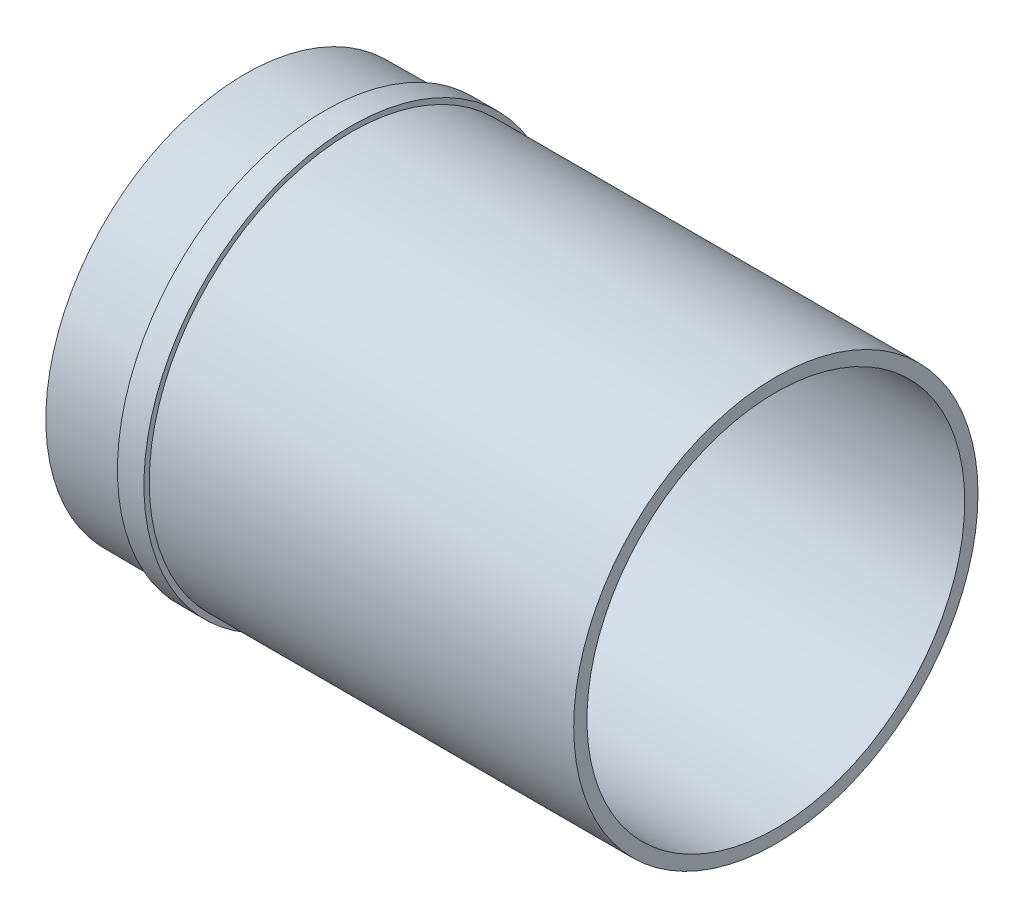
ISO-10303-21;
HEADER;
FILE_DESCRIPTION(('STEP AP214'),'2;1');
FILE_NAME('part.step','',(''),(''),'','','');
FILE_SCHEMA(('AUTOMOTIVE_DESIGN { 1 0 10303 214 1 1 1 1 }'));
ENDSEC;
DATA;
#1=APPLICATION_CONTEXT('core data for automotive mechanical design processes');
#2=APPLICATION_PROTOCOL_DEFINITION('international standard','automotive_design',2000,#1);
#3=PRODUCT_CONTEXT('',#1,'mechanical');
#4=PRODUCT('Part','Part','',(#3));
#5=PRODUCT_RELATED_PRODUCT_CATEGORY('part','',(#4));
#6=PRODUCT_DEFINITION_FORMATION('','',#4);
#7=PRODUCT_DEFINITION_CONTEXT('part definition',#1,'design');
#8=PRODUCT_DEFINITION('design','',#6,#7);
#9=PRODUCT_DEFINITION_SHAPE('','',#8);
#10=(LENGTH_UNIT() NAMED_UNIT(*) SI_UNIT(.MILLI.,.METRE.));
#11=(NAMED_UNIT(*) PLANE_ANGLE_UNIT() SI_UNIT($,.RADIAN.));
#12=(NAMED_UNIT(*) SI_UNIT($,.STERADIAN.) SOLID_ANGLE_UNIT());
#13=UNCERTAINTY_MEASURE_WITH_UNIT(LENGTH_MEASURE(1.E-05),#10,'distance_accuracy_value','');
#14=(GEOMETRIC_REPRESENTATION_CONTEXT(3) GLOBAL_UNCERTAINTY_ASSIGNED_CONTEXT((#13)) GLOBAL_UNIT_ASSIGNED_CONTEXT((#10,
#11,#12)) REPRESENTATION_CONTEXT('',''));
#15=CARTESIAN_POINT('',(0.,0.,0.));
#16=DIRECTION('',(0.,0.,1.));
#17=DIRECTION('',(1.,0.,0.));
#18=AXIS2_PLACEMENT_3D('',#15,#16,#17);
#19=CARTESIAN_POINT('',(-40.,0.,0.));
#20=DIRECTION('',(-1.,0.,0.));
#21=DIRECTION('',(0.,0.,1.));
#22=AXIS2_PLACEMENT_3D('',#19,#20,#21);
#23=PLANE('',#22);
#24=CARTESIAN_POINT('',(-40.,3557.29676158737,0.));
#25=DIRECTION('',(1.,0.,0.));
#26=DIRECTION('',(0.,0.,-1.));
#27=AXIS2_PLACEMENT_3D('',#24,#25,#26);
#28=CIRCLE('',#27,71.2032384126284);
#29=CARTESIAN_POINT('',(-40.,3557.29676158737,-71.2032384126284));
#30=VERTEX_POINT('',#29);
#31=EDGE_CURVE('E10',#30,#30,#28,.T.);
#32=ORIENTED_EDGE('',*,*,#31,.T.);
#33=EDGE_LOOP('',(#32));
#34=FACE_BOUND('',#33,.T.);
#35=CARTESIAN_POINT('',(-40.,3557.29676158737,0.));
#36=DIRECTION('',(1.,0.,0.));
#37=DIRECTION('',(0.,0.,-1.));
#38=AXIS2_PLACEMENT_3D('',#35,#36,#37);
#39=CIRCLE('',#38,75.1830098635295);
#40=CARTESIAN_POINT('',(-40.,3557.29676158737,-75.1830098635295));
#41=VERTEX_POINT('',#40);
#42=EDGE_CURVE('E62',#41,#41,#39,.T.);
#43=ORIENTED_EDGE('',*,*,#42,.F.);
#44=EDGE_LOOP('',(#43));
#45=FACE_BOUND('',#44,.T.);
#46=ADVANCED_FACE('F34',(#34,#45),#23,.T.);
#47=CARTESIAN_POINT('',(0.,3557.29676158737,0.));
#48=DIRECTION('',(1.,0.,0.));
#49=DIRECTION('',(0.,0.,-1.));
#50=AXIS2_PLACEMENT_3D('',#47,#48,#49);
#51=CYLINDRICAL_SURFACE('',#50,71.2032384126284);
#52=CARTESIAN_POINT('',(160.,3557.29676158737,0.));
#53=DIRECTION('',(1.,0.,0.));
#54=DIRECTION('',(0.,0.,-1.));
#55=AXIS2_PLACEMENT_3D('',#52,#53,#54);
#56=CIRCLE('',#55,71.2032384126284);
#57=CARTESIAN_POINT('',(160.,3557.29676158737,-71.2032384126284));
#58=VERTEX_POINT('',#57);
#59=EDGE_CURVE('E40',#58,#58,#56,.T.);
#60=ORIENTED_EDGE('',*,*,#59,.T.);
#61=EDGE_LOOP('',(#60));
#62=FACE_BOUND('',#61,.T.);
#63=ORIENTED_EDGE('',*,*,#31,.F.);
#64=EDGE_LOOP('',(#63));
#65=FACE_BOUND('',#64,.T.);
#66=ADVANCED_FACE('F69',(#62,#65),#51,.F.);
#67=CARTESIAN_POINT('',(160.,0.,0.));
#68=DIRECTION('',(-1.,0.,0.));
#69=DIRECTION('',(0.,0.,1.));
#70=AXIS2_PLACEMENT_3D('',#67,#68,#69);
#71=PLANE('',#70);
#72=ORIENTED_EDGE('',*,*,#59,.F.);
#73=EDGE_LOOP('',(#72));
#74=FACE_BOUND('',#73,.T.);
#75=CARTESIAN_POINT('',(160.,3557.29676158737,0.));
#76=DIRECTION('',(1.,0.,0.));
#77=DIRECTION('',(0.,0.,-1.));
#78=AXIS2_PLACEMENT_3D('',#75,#76,#77);
#79=CIRCLE('',#78,76.2032384126283);
#80=CARTESIAN_POINT('',(160.,3557.29676158737,-76.2032384126283));
#81=VERTEX_POINT('',#80);
#82=EDGE_CURVE('E44',#81,#81,#79,.T.);
#83=ORIENTED_EDGE('',*,*,#82,.T.);
#84=EDGE_LOOP('',(#83));
#85=FACE_BOUND('',#84,.T.);
#86=ADVANCED_FACE('F73',(#74,#85),#71,.F.);
#87=CARTESIAN_POINT('',(0.,3557.29676158737,0.));
#88=DIRECTION('',(1.,0.,0.));
#89=DIRECTION('',(0.,0.,-1.));
#90=AXIS2_PLACEMENT_3D('',#87,#88,#89);
#91=CYLINDRICAL_SURFACE('',#90,76.2032384126283);
#92=ORIENTED_EDGE('',*,*,#82,.F.);
#93=EDGE_LOOP('',(#92));
#94=FACE_BOUND('',#93,.T.);
#95=CARTESIAN_POINT('',(-4.44975414470105E-13,3557.29676158737,0.));
#96=DIRECTION('',(1.,0.,0.));
#97=DIRECTION('',(0.,0.,-1.));
#98=AXIS2_PLACEMENT_3D('',#95,#96,#97);
#99=CIRCLE('',#98,76.2032384126283);
#100=CARTESIAN_POINT('',(-4.44975414470105E-13,3557.29676158737,-76.2032384126283));
#101=VERTEX_POINT('',#100);
#102=EDGE_CURVE('E48',#101,#101,#99,.T.);
#103=ORIENTED_EDGE('',*,*,#102,.T.);
#104=EDGE_LOOP('',(#103));
#105=FACE_BOUND('',#104,.T.);
#106=ADVANCED_FACE('F77',(#94,#105),#91,.T.);
#107=CARTESIAN_POINT('',(-4.45097879150019E-13,0.,0.));
#108=DIRECTION('',(-1.,0.,0.));
#109=DIRECTION('',(0.,0.,1.));
#110=AXIS2_PLACEMENT_3D('',#107,#108,#109);
#111=PLANE('',#110);
#112=ORIENTED_EDGE('',*,*,#102,.F.);
#113=EDGE_LOOP('',(#112));
#114=FACE_BOUND('',#113,.T.);
#115=CARTESIAN_POINT('',(-4.45220343829934E-13,3557.29676158737,0.));
#116=DIRECTION('',(1.,0.,0.));
#117=DIRECTION('',(0.,0.,-1.));
#118=AXIS2_PLACEMENT_3D('',#115,#116,#117);
#119=CIRCLE('',#118,78.2032384126281);
#120=CARTESIAN_POINT('',(-4.45220343829934E-13,3557.29676158737,-78.2032384126281));
#121=VERTEX_POINT('',#120);
#122=EDGE_CURVE('E53',#121,#121,#119,.T.);
#123=ORIENTED_EDGE('',*,*,#122,.T.);
#124=EDGE_LOOP('',(#123));
#125=FACE_BOUND('',#124,.T.);
#126=ADVANCED_FACE('F84',(#114,#125),#111,.F.);
#127=CARTESIAN_POINT('',(0.,3557.29676158737,0.));
#128=DIRECTION('',(1.,0.,0.));
#129=DIRECTION('',(0.,0.,-1.));
#130=AXIS2_PLACEMENT_3D('',#127,#128,#129);
#131=DEGENERATE_TOROIDAL_SURFACE('',#130,3557.29676158737,3635.5,.F.);
#132=CARTESIAN_POINT('',(-10.,3557.29676158737,0.));
#133=DIRECTION('',(1.,0.,0.));
#134=DIRECTION('',(0.,0.,-1.));
#135=AXIS2_PLACEMENT_3D('',#132,#133,#134);
#136=CIRCLE('',#135,78.1894851202125);
#137=CARTESIAN_POINT('',(-10.,3557.29676158737,-78.1894851202125));
#138=VERTEX_POINT('',#137);
#139=EDGE_CURVE('E56',#138,#138,#136,.T.);
#140=ORIENTED_EDGE('',*,*,#139,.T.);
#141=EDGE_LOOP('',(#140));
#142=FACE_BOUND('',#141,.T.);
#143=ORIENTED_EDGE('',*,*,#122,.F.);
#144=EDGE_LOOP('',(#143));
#145=FACE_BOUND('',#144,.T.);
#146=ADVANCED_FACE('F88',(#142,#145),#131,.F.);
#147=CARTESIAN_POINT('',(-10.,0.,0.));
#148=DIRECTION('',(1.,0.,0.));
#149=DIRECTION('',(0.,0.,-1.));
#150=AXIS2_PLACEMENT_3D('',#147,#148,#149);
#151=PLANE('',#150);
#152=ORIENTED_EDGE('',*,*,#139,.F.);
#153=EDGE_LOOP('',(#152));
#154=FACE_BOUND('',#153,.T.);
#155=CARTESIAN_POINT('',(-10.,3557.29676158737,0.));
#156=DIRECTION('',(1.,0.,0.));
#157=DIRECTION('',(0.,0.,-1.));
#158=AXIS2_PLACEMENT_3D('',#155,#156,#157);
#159=CIRCLE('',#158,75.3894745194561);
#160=CARTESIAN_POINT('',(-10.,3557.29676158737,-75.3894745194561));
#161=VERTEX_POINT('',#160);
#162=EDGE_CURVE('E59',#161,#161,#159,.T.);
#163=ORIENTED_EDGE('',*,*,#162,.T.);
#164=EDGE_LOOP('',(#163));
#165=FACE_BOUND('',#164,.T.);
#166=ADVANCED_FACE('F92',(#154,#165),#151,.F.);
#167=CARTESIAN_POINT('',(0.,3557.29676158737,0.));
#168=DIRECTION('',(1.,0.,0.));
#169=DIRECTION('',(0.,0.,-1.));
#170=AXIS2_PLACEMENT_3D('',#167,#168,#169);
#171=DEGENERATE_TOROIDAL_SURFACE('',#170,3557.29676158737,3632.7,.F.);
#172=ORIENTED_EDGE('',*,*,#162,.F.);
#173=EDGE_LOOP('',(#172));
#174=FACE_BOUND('',#173,.T.);
#175=ORIENTED_EDGE('',*,*,#42,.T.);
#176=EDGE_LOOP('',(#175));
#177=FACE_BOUND('',#176,.T.);
#178=ADVANCED_FACE('F66',(#174,#177),#171,.F.);
#179=CLOSED_SHELL('',(#46,#66,#86,#106,#126,#146,#166,#178));
#180=MANIFOLD_SOLID_BREP('B2',#179);
#181=ADVANCED_BREP_SHAPE_REPRESENTATION('',(#18,#180),#14);
#182=SHAPE_DEFINITION_REPRESENTATION(#9,#181);
ENDSEC;
END-ISO-10303-21;
